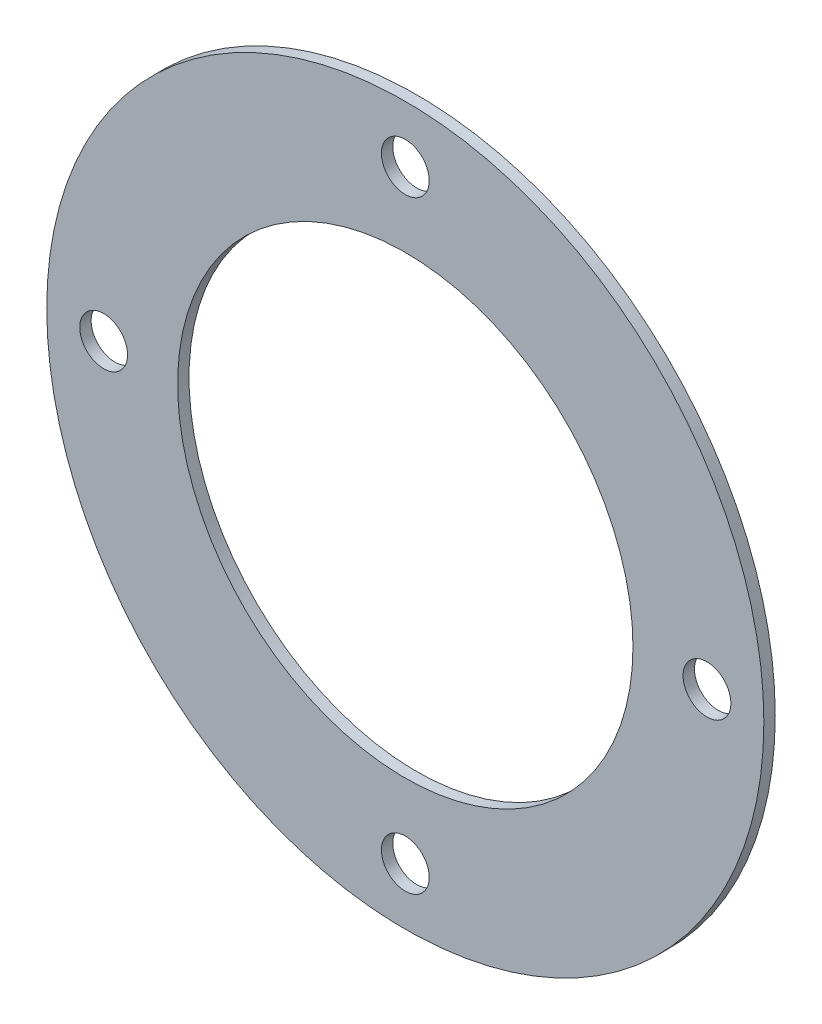
ISO-10303-21;
HEADER;
FILE_DESCRIPTION(('STEP AP214'),'2;1');
FILE_NAME('part.step','',(''),(''),'','','');
FILE_SCHEMA(('AUTOMOTIVE_DESIGN { 1 0 10303 214 1 1 1 1 }'));
ENDSEC;
DATA;
#1=APPLICATION_CONTEXT('core data for automotive mechanical design processes');
#2=APPLICATION_PROTOCOL_DEFINITION('international standard','automotive_design',2000,#1);
#3=PRODUCT_CONTEXT('',#1,'mechanical');
#4=PRODUCT('Part','Part','',(#3));
#5=PRODUCT_RELATED_PRODUCT_CATEGORY('part','',(#4));
#6=PRODUCT_DEFINITION_FORMATION('','',#4);
#7=PRODUCT_DEFINITION_CONTEXT('part definition',#1,'design');
#8=PRODUCT_DEFINITION('design','',#6,#7);
#9=PRODUCT_DEFINITION_SHAPE('','',#8);
#10=(LENGTH_UNIT() NAMED_UNIT(*) SI_UNIT(.MILLI.,.METRE.));
#11=(NAMED_UNIT(*) PLANE_ANGLE_UNIT() SI_UNIT($,.RADIAN.));
#12=(NAMED_UNIT(*) SI_UNIT($,.STERADIAN.) SOLID_ANGLE_UNIT());
#13=UNCERTAINTY_MEASURE_WITH_UNIT(LENGTH_MEASURE(1.E-05),#10,'distance_accuracy_value','');
#14=(GEOMETRIC_REPRESENTATION_CONTEXT(3) GLOBAL_UNCERTAINTY_ASSIGNED_CONTEXT((#13)) GLOBAL_UNIT_ASSIGNED_CONTEXT((#10,
#11,#12)) REPRESENTATION_CONTEXT('',''));
#15=CARTESIAN_POINT('',(0.,0.,0.));
#16=DIRECTION('',(0.,0.,1.));
#17=DIRECTION('',(1.,0.,0.));
#18=AXIS2_PLACEMENT_3D('',#15,#16,#17);
#19=CARTESIAN_POINT('',(0.,0.,1.));
#20=DIRECTION('',(0.,0.,1.));
#21=DIRECTION('',(1.,0.,0.));
#22=AXIS2_PLACEMENT_3D('',#19,#20,#21);
#23=PLANE('',#22);
#24=CARTESIAN_POINT('',(1.41208431754647E-12,-26.5,1.));
#25=DIRECTION('',(0.,0.,1.));
#26=DIRECTION('',(1.,0.,0.));
#27=AXIS2_PLACEMENT_3D('',#24,#25,#26);
#28=CIRCLE('',#27,2.1);
#29=CARTESIAN_POINT('',(2.10000000000141,-26.5,1.));
#30=VERTEX_POINT('',#29);
#31=EDGE_CURVE('E60',#30,#30,#28,.T.);
#32=ORIENTED_EDGE('',*,*,#31,.F.);
#33=EDGE_LOOP('',(#32));
#34=FACE_BOUND('',#33,.T.);
#35=CARTESIAN_POINT('',(0.,26.5,1.));
#36=DIRECTION('',(0.,0.,1.));
#37=DIRECTION('',(1.,0.,0.));
#38=AXIS2_PLACEMENT_3D('',#35,#36,#37);
#39=CIRCLE('',#38,2.1);
#40=CARTESIAN_POINT('',(2.1,26.5,1.));
#41=VERTEX_POINT('',#40);
#42=EDGE_CURVE('E48',#41,#41,#39,.T.);
#43=ORIENTED_EDGE('',*,*,#42,.F.);
#44=EDGE_LOOP('',(#43));
#45=FACE_BOUND('',#44,.T.);
#46=CARTESIAN_POINT('',(0.,0.,1.));
#47=DIRECTION('',(0.,0.,1.));
#48=DIRECTION('',(1.,0.,0.));
#49=AXIS2_PLACEMENT_3D('',#46,#47,#48);
#50=CIRCLE('',#49,31.5);
#51=CARTESIAN_POINT('',(31.5,0.,1.));
#52=VERTEX_POINT('',#51);
#53=EDGE_CURVE('E10',#52,#52,#50,.T.);
#54=ORIENTED_EDGE('',*,*,#53,.T.);
#55=EDGE_LOOP('',(#54));
#56=FACE_BOUND('',#55,.T.);
#57=CARTESIAN_POINT('',(0.,0.,1.));
#58=DIRECTION('',(0.,0.,1.));
#59=DIRECTION('',(1.,0.,0.));
#60=AXIS2_PLACEMENT_3D('',#57,#58,#59);
#61=CIRCLE('',#60,20.);
#62=CARTESIAN_POINT('',(20.,0.,1.));
#63=VERTEX_POINT('',#62);
#64=EDGE_CURVE('E43',#63,#63,#61,.T.);
#65=ORIENTED_EDGE('',*,*,#64,.F.);
#66=EDGE_LOOP('',(#65));
#67=FACE_BOUND('',#66,.T.);
#68=CARTESIAN_POINT('',(26.5000000000007,7.06042158773234E-13,1.));
#69=DIRECTION('',(0.,0.,1.));
#70=DIRECTION('',(1.,0.,0.));
#71=AXIS2_PLACEMENT_3D('',#68,#69,#70);
#72=CIRCLE('',#71,2.1);
#73=CARTESIAN_POINT('',(28.6000000000007,7.06042158773234E-13,1.));
#74=VERTEX_POINT('',#73);
#75=EDGE_CURVE('E54',#74,#74,#72,.T.);
#76=ORIENTED_EDGE('',*,*,#75,.F.);
#77=EDGE_LOOP('',(#76));
#78=FACE_BOUND('',#77,.T.);
#79=CARTESIAN_POINT('',(-26.4999999999993,-7.09287472790974E-13,1.));
#80=DIRECTION('',(0.,0.,1.));
#81=DIRECTION('',(1.,0.,0.));
#82=AXIS2_PLACEMENT_3D('',#79,#80,#81);
#83=CIRCLE('',#82,2.1);
#84=CARTESIAN_POINT('',(-24.3999999999993,-7.09287472790974E-13,1.));
#85=VERTEX_POINT('',#84);
#86=EDGE_CURVE('E66',#85,#85,#83,.T.);
#87=ORIENTED_EDGE('',*,*,#86,.F.);
#88=EDGE_LOOP('',(#87));
#89=FACE_BOUND('',#88,.T.);
#90=ADVANCED_FACE('F32',(#34,#45,#56,#67,#78,#89),#23,.T.);
#91=CARTESIAN_POINT('',(0.,0.,0.));
#92=DIRECTION('',(0.,0.,1.));
#93=DIRECTION('',(1.,0.,0.));
#94=AXIS2_PLACEMENT_3D('',#91,#92,#93);
#95=PLANE('',#94);
#96=CARTESIAN_POINT('',(0.,0.,0.));
#97=DIRECTION('',(0.,0.,1.));
#98=DIRECTION('',(1.,0.,0.));
#99=AXIS2_PLACEMENT_3D('',#96,#97,#98);
#100=CIRCLE('',#99,31.5);
#101=CARTESIAN_POINT('',(31.5,0.,0.));
#102=VERTEX_POINT('',#101);
#103=EDGE_CURVE('E36',#102,#102,#100,.T.);
#104=ORIENTED_EDGE('',*,*,#103,.F.);
#105=EDGE_LOOP('',(#104));
#106=FACE_BOUND('',#105,.T.);
#107=CARTESIAN_POINT('',(0.,0.,0.));
#108=DIRECTION('',(0.,0.,1.));
#109=DIRECTION('',(1.,0.,0.));
#110=AXIS2_PLACEMENT_3D('',#107,#108,#109);
#111=CIRCLE('',#110,20.);
#112=CARTESIAN_POINT('',(20.,0.,0.));
#113=VERTEX_POINT('',#112);
#114=EDGE_CURVE('E45',#113,#113,#111,.T.);
#115=ORIENTED_EDGE('',*,*,#114,.T.);
#116=EDGE_LOOP('',(#115));
#117=FACE_BOUND('',#116,.T.);
#118=CARTESIAN_POINT('',(0.,26.5,0.));
#119=DIRECTION('',(0.,0.,1.));
#120=DIRECTION('',(1.,0.,0.));
#121=AXIS2_PLACEMENT_3D('',#118,#119,#120);
#122=CIRCLE('',#121,2.1);
#123=CARTESIAN_POINT('',(2.1,26.5,0.));
#124=VERTEX_POINT('',#123);
#125=EDGE_CURVE('E51',#124,#124,#122,.T.);
#126=ORIENTED_EDGE('',*,*,#125,.T.);
#127=EDGE_LOOP('',(#126));
#128=FACE_BOUND('',#127,.T.);
#129=CARTESIAN_POINT('',(26.5000000000007,7.06042158773234E-13,0.));
#130=DIRECTION('',(0.,0.,1.));
#131=DIRECTION('',(1.,0.,0.));
#132=AXIS2_PLACEMENT_3D('',#129,#130,#131);
#133=CIRCLE('',#132,2.1);
#134=CARTESIAN_POINT('',(28.6000000000007,7.06042158773234E-13,0.));
#135=VERTEX_POINT('',#134);
#136=EDGE_CURVE('E57',#135,#135,#133,.T.);
#137=ORIENTED_EDGE('',*,*,#136,.T.);
#138=EDGE_LOOP('',(#137));
#139=FACE_BOUND('',#138,.T.);
#140=CARTESIAN_POINT('',(1.41208431754647E-12,-26.5,0.));
#141=DIRECTION('',(0.,0.,1.));
#142=DIRECTION('',(1.,0.,0.));
#143=AXIS2_PLACEMENT_3D('',#140,#141,#142);
#144=CIRCLE('',#143,2.1);
#145=CARTESIAN_POINT('',(2.10000000000141,-26.5,0.));
#146=VERTEX_POINT('',#145);
#147=EDGE_CURVE('E63',#146,#146,#144,.T.);
#148=ORIENTED_EDGE('',*,*,#147,.T.);
#149=EDGE_LOOP('',(#148));
#150=FACE_BOUND('',#149,.T.);
#151=CARTESIAN_POINT('',(-26.4999999999993,-7.09287472790974E-13,0.));
#152=DIRECTION('',(0.,0.,1.));
#153=DIRECTION('',(1.,0.,0.));
#154=AXIS2_PLACEMENT_3D('',#151,#152,#153);
#155=CIRCLE('',#154,2.1);
#156=CARTESIAN_POINT('',(-24.3999999999993,-7.09287472790974E-13,0.));
#157=VERTEX_POINT('',#156);
#158=EDGE_CURVE('E69',#157,#157,#155,.T.);
#159=ORIENTED_EDGE('',*,*,#158,.T.);
#160=EDGE_LOOP('',(#159));
#161=FACE_BOUND('',#160,.T.);
#162=ADVANCED_FACE('F79',(#106,#117,#128,#139,#150,#161),#95,.F.);
#163=CARTESIAN_POINT('',(0.,0.,1.));
#164=DIRECTION('',(0.,0.,-1.));
#165=DIRECTION('',(-1.,0.,0.));
#166=AXIS2_PLACEMENT_3D('',#163,#164,#165);
#167=CYLINDRICAL_SURFACE('',#166,31.5);
#168=ORIENTED_EDGE('',*,*,#53,.F.);
#169=EDGE_LOOP('',(#168));
#170=FACE_BOUND('',#169,.T.);
#171=ORIENTED_EDGE('',*,*,#103,.T.);
#172=EDGE_LOOP('',(#171));
#173=FACE_BOUND('',#172,.T.);
#174=ADVANCED_FACE('F34',(#170,#173),#167,.T.);
#175=CARTESIAN_POINT('',(0.,0.,1.));
#176=DIRECTION('',(0.,0.,-1.));
#177=DIRECTION('',(-1.,0.,0.));
#178=AXIS2_PLACEMENT_3D('',#175,#176,#177);
#179=CYLINDRICAL_SURFACE('',#178,20.);
#180=ORIENTED_EDGE('',*,*,#64,.T.);
#181=EDGE_LOOP('',(#180));
#182=FACE_BOUND('',#181,.T.);
#183=ORIENTED_EDGE('',*,*,#114,.F.);
#184=EDGE_LOOP('',(#183));
#185=FACE_BOUND('',#184,.T.);
#186=ADVANCED_FACE('F89',(#182,#185),#179,.F.);
#187=CARTESIAN_POINT('',(0.,26.5,1.));
#188=DIRECTION('',(0.,0.,-1.));
#189=DIRECTION('',(-1.,0.,0.));
#190=AXIS2_PLACEMENT_3D('',#187,#188,#189);
#191=CYLINDRICAL_SURFACE('',#190,2.1);
#192=ORIENTED_EDGE('',*,*,#42,.T.);
#193=EDGE_LOOP('',(#192));
#194=FACE_BOUND('',#193,.T.);
#195=ORIENTED_EDGE('',*,*,#125,.F.);
#196=EDGE_LOOP('',(#195));
#197=FACE_BOUND('',#196,.T.);
#198=ADVANCED_FACE('F92',(#194,#197),#191,.F.);
#199=CARTESIAN_POINT('',(26.5000000000007,7.06042158773234E-13,1.));
#200=DIRECTION('',(0.,0.,-1.));
#201=DIRECTION('',(-1.,0.,0.));
#202=AXIS2_PLACEMENT_3D('',#199,#200,#201);
#203=CYLINDRICAL_SURFACE('',#202,2.1);
#204=ORIENTED_EDGE('',*,*,#75,.T.);
#205=EDGE_LOOP('',(#204));
#206=FACE_BOUND('',#205,.T.);
#207=ORIENTED_EDGE('',*,*,#136,.F.);
#208=EDGE_LOOP('',(#207));
#209=FACE_BOUND('',#208,.T.);
#210=ADVANCED_FACE('F96',(#206,#209),#203,.F.);
#211=CARTESIAN_POINT('',(1.41208431754647E-12,-26.5,1.));
#212=DIRECTION('',(0.,0.,-1.));
#213=DIRECTION('',(-1.,0.,0.));
#214=AXIS2_PLACEMENT_3D('',#211,#212,#213);
#215=CYLINDRICAL_SURFACE('',#214,2.1);
#216=ORIENTED_EDGE('',*,*,#31,.T.);
#217=EDGE_LOOP('',(#216));
#218=FACE_BOUND('',#217,.T.);
#219=ORIENTED_EDGE('',*,*,#147,.F.);
#220=EDGE_LOOP('',(#219));
#221=FACE_BOUND('',#220,.T.);
#222=ADVANCED_FACE('F100',(#218,#221),#215,.F.);
#223=CARTESIAN_POINT('',(-26.4999999999993,-7.09287472790974E-13,1.));
#224=DIRECTION('',(0.,0.,-1.));
#225=DIRECTION('',(-1.,0.,0.));
#226=AXIS2_PLACEMENT_3D('',#223,#224,#225);
#227=CYLINDRICAL_SURFACE('',#226,2.1);
#228=ORIENTED_EDGE('',*,*,#86,.T.);
#229=EDGE_LOOP('',(#228));
#230=FACE_BOUND('',#229,.T.);
#231=ORIENTED_EDGE('',*,*,#158,.F.);
#232=EDGE_LOOP('',(#231));
#233=FACE_BOUND('',#232,.T.);
#234=ADVANCED_FACE('F75',(#230,#233),#227,.F.);
#235=CLOSED_SHELL('',(#90,#162,#174,#186,#198,#210,#222,#234));
#236=MANIFOLD_SOLID_BREP('B2',#235);
#237=ADVANCED_BREP_SHAPE_REPRESENTATION('',(#18,#236),#14);
#238=SHAPE_DEFINITION_REPRESENTATION(#9,#237);
ENDSEC;
END-ISO-10303-21;
